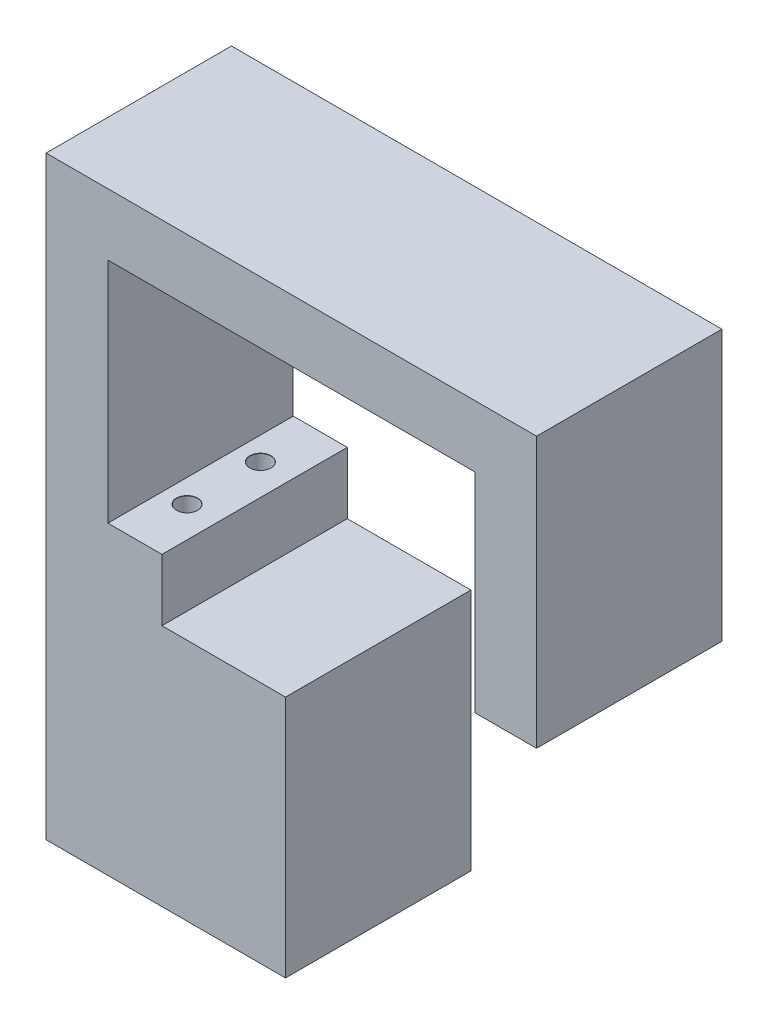
ISO-10303-21;
HEADER;
FILE_DESCRIPTION(('STEP AP214'),'2;1');
FILE_NAME('part.step','',(''),(''),'','','');
FILE_SCHEMA(('AUTOMOTIVE_DESIGN { 1 0 10303 214 1 1 1 1 }'));
ENDSEC;
DATA;
#1=APPLICATION_CONTEXT('core data for automotive mechanical design processes');
#2=APPLICATION_PROTOCOL_DEFINITION('international standard','automotive_design',2000,#1);
#3=PRODUCT_CONTEXT('',#1,'mechanical');
#4=PRODUCT('Part','Part','',(#3));
#5=PRODUCT_RELATED_PRODUCT_CATEGORY('part','',(#4));
#6=PRODUCT_DEFINITION_FORMATION('','',#4);
#7=PRODUCT_DEFINITION_CONTEXT('part definition',#1,'design');
#8=PRODUCT_DEFINITION('design','',#6,#7);
#9=PRODUCT_DEFINITION_SHAPE('','',#8);
#10=(LENGTH_UNIT() NAMED_UNIT(*) SI_UNIT(.MILLI.,.METRE.));
#11=(NAMED_UNIT(*) PLANE_ANGLE_UNIT() SI_UNIT($,.RADIAN.));
#12=(NAMED_UNIT(*) SI_UNIT($,.STERADIAN.) SOLID_ANGLE_UNIT());
#13=UNCERTAINTY_MEASURE_WITH_UNIT(LENGTH_MEASURE(1.E-05),#10,'distance_accuracy_value','');
#14=(GEOMETRIC_REPRESENTATION_CONTEXT(3) GLOBAL_UNCERTAINTY_ASSIGNED_CONTEXT((#13)) GLOBAL_UNIT_ASSIGNED_CONTEXT((#10,
#11,#12)) REPRESENTATION_CONTEXT('',''));
#15=CARTESIAN_POINT('',(0.,0.,0.));
#16=DIRECTION('',(0.,0.,1.));
#17=DIRECTION('',(1.,0.,0.));
#18=AXIS2_PLACEMENT_3D('',#15,#16,#17);
#19=CARTESIAN_POINT('',(0.,31.5,12.));
#20=DIRECTION('',(-1.,0.,0.));
#21=DIRECTION('',(0.,-1.,0.));
#22=AXIS2_PLACEMENT_3D('',#19,#20,#21);
#23=PLANE('',#22);
#24=DIRECTION('',(0.,1.,0.));
#25=VECTOR('',#24,1.);
#26=CARTESIAN_POINT('',(0.,31.5,-12.));
#27=LINE('',#26,#25);
#28=CARTESIAN_POINT('',(0.,0.,-12.));
#29=VERTEX_POINT('',#28);
#30=CARTESIAN_POINT('',(0.,31.5,-12.));
#31=VERTEX_POINT('',#30);
#32=EDGE_CURVE('E170',#29,#31,#27,.T.);
#33=ORIENTED_EDGE('',*,*,#32,.T.);
#34=DIRECTION('',(0.,0.,-1.));
#35=VECTOR('',#34,1.);
#36=CARTESIAN_POINT('',(0.,31.5,12.));
#37=LINE('',#36,#35);
#38=CARTESIAN_POINT('',(0.,31.5,12.));
#39=VERTEX_POINT('',#38);
#40=EDGE_CURVE('E11',#39,#31,#37,.T.);
#41=ORIENTED_EDGE('',*,*,#40,.F.);
#42=DIRECTION('',(0.,1.,0.));
#43=VECTOR('',#42,1.);
#44=CARTESIAN_POINT('',(0.,31.5,12.));
#45=LINE('',#44,#43);
#46=CARTESIAN_POINT('',(0.,0.,12.));
#47=VERTEX_POINT('',#46);
#48=EDGE_CURVE('E195',#47,#39,#45,.T.);
#49=ORIENTED_EDGE('',*,*,#48,.F.);
#50=DIRECTION('',(0.,0.,-1.));
#51=VECTOR('',#50,1.);
#52=CARTESIAN_POINT('',(0.,0.,12.));
#53=LINE('',#52,#51);
#54=EDGE_CURVE('E166',#47,#29,#53,.T.);
#55=ORIENTED_EDGE('',*,*,#54,.T.);
#56=EDGE_LOOP('',(#33,#41,#49,#55));
#57=FACE_BOUND('',#56,.T.);
#58=ADVANCED_FACE('F47',(#57),#23,.F.);
#59=CARTESIAN_POINT('',(-16.,31.5,12.));
#60=DIRECTION('',(0.,-1.,0.));
#61=DIRECTION('',(0.,0.,-1.));
#62=AXIS2_PLACEMENT_3D('',#59,#60,#61);
#63=PLANE('',#62);
#64=DIRECTION('',(-1.,0.,0.));
#65=VECTOR('',#64,1.);
#66=CARTESIAN_POINT('',(-16.,31.5,-12.));
#67=LINE('',#66,#65);
#68=CARTESIAN_POINT('',(-16.,31.5,-12.));
#69=VERTEX_POINT('',#68);
#70=EDGE_CURVE('E173',#31,#69,#67,.T.);
#71=ORIENTED_EDGE('',*,*,#70,.T.);
#72=DIRECTION('',(0.,0.,-1.));
#73=VECTOR('',#72,1.);
#74=CARTESIAN_POINT('',(-16.,31.5,12.));
#75=LINE('',#74,#73);
#76=CARTESIAN_POINT('',(-16.,31.5,12.));
#77=VERTEX_POINT('',#76);
#78=EDGE_CURVE('E55',#77,#69,#75,.T.);
#79=ORIENTED_EDGE('',*,*,#78,.F.);
#80=DIRECTION('',(-1.,0.,0.));
#81=VECTOR('',#80,1.);
#82=CARTESIAN_POINT('',(-16.,31.5,12.));
#83=LINE('',#82,#81);
#84=EDGE_CURVE('E117',#39,#77,#83,.T.);
#85=ORIENTED_EDGE('',*,*,#84,.F.);
#86=ORIENTED_EDGE('',*,*,#40,.T.);
#87=EDGE_LOOP('',(#71,#79,#85,#86));
#88=FACE_BOUND('',#87,.T.);
#89=ADVANCED_FACE('F327',(#88),#63,.F.);
#90=CARTESIAN_POINT('',(-16.,39.5,12.));
#91=DIRECTION('',(-1.,0.,0.));
#92=DIRECTION('',(0.,0.,1.));
#93=AXIS2_PLACEMENT_3D('',#90,#91,#92);
#94=PLANE('',#93);
#95=DIRECTION('',(0.,1.,0.));
#96=VECTOR('',#95,1.);
#97=CARTESIAN_POINT('',(-16.,39.5,-12.));
#98=LINE('',#97,#96);
#99=CARTESIAN_POINT('',(-16.,39.5,-12.));
#100=VERTEX_POINT('',#99);
#101=EDGE_CURVE('E176',#69,#100,#98,.T.);
#102=ORIENTED_EDGE('',*,*,#101,.T.);
#103=DIRECTION('',(0.,0.,-1.));
#104=VECTOR('',#103,1.);
#105=CARTESIAN_POINT('',(-16.,39.5,12.));
#106=LINE('',#105,#104);
#107=CARTESIAN_POINT('',(-16.,39.5,12.));
#108=VERTEX_POINT('',#107);
#109=EDGE_CURVE('E214',#108,#100,#106,.T.);
#110=ORIENTED_EDGE('',*,*,#109,.F.);
#111=DIRECTION('',(0.,1.,0.));
#112=VECTOR('',#111,1.);
#113=CARTESIAN_POINT('',(-16.,39.5,12.));
#114=LINE('',#113,#112);
#115=EDGE_CURVE('E222',#77,#108,#114,.T.);
#116=ORIENTED_EDGE('',*,*,#115,.F.);
#117=ORIENTED_EDGE('',*,*,#78,.T.);
#118=EDGE_LOOP('',(#102,#110,#116,#117));
#119=FACE_BOUND('',#118,.T.);
#120=ADVANCED_FACE('F220',(#119),#94,.F.);
#121=CARTESIAN_POINT('',(-23.,39.5,12.));
#122=DIRECTION('',(0.,-1.,0.));
#123=DIRECTION('',(0.,0.,-1.));
#124=AXIS2_PLACEMENT_3D('',#121,#122,#123);
#125=PLANE('',#124);
#126=CARTESIAN_POINT('',(-20.,39.5,-4.75));
#127=DIRECTION('',(0.,1.,0.));
#128=DIRECTION('',(0.,0.,1.));
#129=AXIS2_PLACEMENT_3D('',#126,#127,#128);
#130=CIRCLE('',#129,1.375);
#131=CARTESIAN_POINT('',(-20.,39.5,-3.375));
#132=VERTEX_POINT('',#131);
#133=EDGE_CURVE('E279',#132,#132,#130,.T.);
#134=ORIENTED_EDGE('',*,*,#133,.F.);
#135=EDGE_LOOP('',(#134));
#136=FACE_BOUND('',#135,.T.);
#137=CARTESIAN_POINT('',(-20.,39.5,4.75));
#138=DIRECTION('',(0.,1.,0.));
#139=DIRECTION('',(0.,0.,1.));
#140=AXIS2_PLACEMENT_3D('',#137,#138,#139);
#141=CIRCLE('',#140,1.375);
#142=CARTESIAN_POINT('',(-20.,39.5,6.125));
#143=VERTEX_POINT('',#142);
#144=EDGE_CURVE('E270',#143,#143,#141,.T.);
#145=ORIENTED_EDGE('',*,*,#144,.F.);
#146=EDGE_LOOP('',(#145));
#147=FACE_BOUND('',#146,.T.);
#148=DIRECTION('',(-1.,0.,0.));
#149=VECTOR('',#148,1.);
#150=CARTESIAN_POINT('',(-23.,39.5,-12.));
#151=LINE('',#150,#149);
#152=CARTESIAN_POINT('',(-23.,39.5,-12.));
#153=VERTEX_POINT('',#152);
#154=EDGE_CURVE('E178',#100,#153,#151,.T.);
#155=ORIENTED_EDGE('',*,*,#154,.T.);
#156=DIRECTION('',(0.,0.,-1.));
#157=VECTOR('',#156,1.);
#158=CARTESIAN_POINT('',(-23.,39.5,12.));
#159=LINE('',#158,#157);
#160=CARTESIAN_POINT('',(-23.,39.5,12.));
#161=VERTEX_POINT('',#160);
#162=EDGE_CURVE('E211',#161,#153,#159,.T.);
#163=ORIENTED_EDGE('',*,*,#162,.F.);
#164=DIRECTION('',(-1.,0.,0.));
#165=VECTOR('',#164,1.);
#166=CARTESIAN_POINT('',(-23.,39.5,12.));
#167=LINE('',#166,#165);
#168=EDGE_CURVE('E238',#108,#161,#167,.T.);
#169=ORIENTED_EDGE('',*,*,#168,.F.);
#170=ORIENTED_EDGE('',*,*,#109,.T.);
#171=EDGE_LOOP('',(#155,#163,#169,#170));
#172=FACE_BOUND('',#171,.T.);
#173=ADVANCED_FACE('F229',(#136,#147,#172),#125,.F.);
#174=CARTESIAN_POINT('',(-23.,39.5,12.));
#175=DIRECTION('',(-1.,0.,0.));
#176=DIRECTION('',(0.,0.,1.));
#177=AXIS2_PLACEMENT_3D('',#174,#175,#176);
#178=PLANE('',#177);
#179=DIRECTION('',(0.,1.,0.));
#180=VECTOR('',#179,1.);
#181=CARTESIAN_POINT('',(-23.,39.5,-12.));
#182=LINE('',#181,#180);
#183=CARTESIAN_POINT('',(-23.,69.,-12.));
#184=VERTEX_POINT('',#183);
#185=EDGE_CURVE('E180',#153,#184,#182,.T.);
#186=ORIENTED_EDGE('',*,*,#185,.T.);
#187=DIRECTION('',(0.,0.,-1.));
#188=VECTOR('',#187,1.);
#189=CARTESIAN_POINT('',(-23.,69.,12.));
#190=LINE('',#189,#188);
#191=CARTESIAN_POINT('',(-23.,69.,12.));
#192=VERTEX_POINT('',#191);
#193=EDGE_CURVE('E208',#192,#184,#190,.T.);
#194=ORIENTED_EDGE('',*,*,#193,.F.);
#195=DIRECTION('',(0.,1.,0.));
#196=VECTOR('',#195,1.);
#197=CARTESIAN_POINT('',(-23.,39.5,12.));
#198=LINE('',#197,#196);
#199=EDGE_CURVE('E235',#161,#192,#198,.T.);
#200=ORIENTED_EDGE('',*,*,#199,.F.);
#201=ORIENTED_EDGE('',*,*,#162,.T.);
#202=EDGE_LOOP('',(#186,#194,#200,#201));
#203=FACE_BOUND('',#202,.T.);
#204=ADVANCED_FACE('F233',(#203),#178,.F.);
#205=CARTESIAN_POINT('',(-23.,69.,12.));
#206=DIRECTION('',(0.,1.,0.));
#207=DIRECTION('',(0.,0.,1.));
#208=AXIS2_PLACEMENT_3D('',#205,#206,#207);
#209=PLANE('',#208);
#210=DIRECTION('',(1.,0.,0.));
#211=VECTOR('',#210,1.);
#212=CARTESIAN_POINT('',(-23.,69.,-12.));
#213=LINE('',#212,#211);
#214=CARTESIAN_POINT('',(24.5,69.,-12.));
#215=VERTEX_POINT('',#214);
#216=EDGE_CURVE('E182',#184,#215,#213,.T.);
#217=ORIENTED_EDGE('',*,*,#216,.T.);
#218=DIRECTION('',(0.,0.,-1.));
#219=VECTOR('',#218,1.);
#220=CARTESIAN_POINT('',(24.5,69.,12.));
#221=LINE('',#220,#219);
#222=CARTESIAN_POINT('',(24.5,69.,12.));
#223=VERTEX_POINT('',#222);
#224=EDGE_CURVE('E205',#223,#215,#221,.T.);
#225=ORIENTED_EDGE('',*,*,#224,.F.);
#226=DIRECTION('',(1.,0.,0.));
#227=VECTOR('',#226,1.);
#228=CARTESIAN_POINT('',(-23.,69.,12.));
#229=LINE('',#228,#227);
#230=EDGE_CURVE('E237',#192,#223,#229,.T.);
#231=ORIENTED_EDGE('',*,*,#230,.F.);
#232=ORIENTED_EDGE('',*,*,#193,.T.);
#233=EDGE_LOOP('',(#217,#225,#231,#232));
#234=FACE_BOUND('',#233,.T.);
#235=ADVANCED_FACE('F341',(#234),#209,.F.);
#236=CARTESIAN_POINT('',(24.5,69.,12.));
#237=DIRECTION('',(1.,0.,0.));
#238=DIRECTION('',(0.,1.,0.));
#239=AXIS2_PLACEMENT_3D('',#236,#237,#238);
#240=PLANE('',#239);
#241=DIRECTION('',(0.,-1.,0.));
#242=VECTOR('',#241,1.);
#243=CARTESIAN_POINT('',(24.5,69.,-12.));
#244=LINE('',#243,#242);
#245=CARTESIAN_POINT('',(24.5,42.,-12.));
#246=VERTEX_POINT('',#245);
#247=EDGE_CURVE('E184',#215,#246,#244,.T.);
#248=ORIENTED_EDGE('',*,*,#247,.T.);
#249=DIRECTION('',(0.,0.,-1.));
#250=VECTOR('',#249,1.);
#251=CARTESIAN_POINT('',(24.5,42.,12.));
#252=LINE('',#251,#250);
#253=CARTESIAN_POINT('',(24.5,42.,12.));
#254=VERTEX_POINT('',#253);
#255=EDGE_CURVE('E202',#254,#246,#252,.T.);
#256=ORIENTED_EDGE('',*,*,#255,.F.);
#257=DIRECTION('',(0.,-1.,0.));
#258=VECTOR('',#257,1.);
#259=CARTESIAN_POINT('',(24.5,69.,12.));
#260=LINE('',#259,#258);
#261=EDGE_CURVE('E240',#223,#254,#260,.T.);
#262=ORIENTED_EDGE('',*,*,#261,.F.);
#263=ORIENTED_EDGE('',*,*,#224,.T.);
#264=EDGE_LOOP('',(#248,#256,#262,#263));
#265=FACE_BOUND('',#264,.T.);
#266=ADVANCED_FACE('F305',(#265),#240,.F.);
#267=CARTESIAN_POINT('',(24.5,42.,12.));
#268=DIRECTION('',(0.,1.,0.));
#269=DIRECTION('',(0.,0.,1.));
#270=AXIS2_PLACEMENT_3D('',#267,#268,#269);
#271=PLANE('',#270);
#272=CARTESIAN_POINT('',(28.5,42.,-4.75));
#273=DIRECTION('',(0.,-1.,0.));
#274=DIRECTION('',(0.,0.,-1.));
#275=AXIS2_PLACEMENT_3D('',#272,#273,#274);
#276=CIRCLE('',#275,1.375);
#277=CARTESIAN_POINT('',(28.5,42.,-6.125));
#278=VERTEX_POINT('',#277);
#279=EDGE_CURVE('E297',#278,#278,#276,.T.);
#280=ORIENTED_EDGE('',*,*,#279,.F.);
#281=EDGE_LOOP('',(#280));
#282=FACE_BOUND('',#281,.T.);
#283=CARTESIAN_POINT('',(28.5,42.,4.75));
#284=DIRECTION('',(0.,-1.,0.));
#285=DIRECTION('',(0.,0.,-1.));
#286=AXIS2_PLACEMENT_3D('',#283,#284,#285);
#287=CIRCLE('',#286,1.375);
#288=CARTESIAN_POINT('',(28.5,42.,3.375));
#289=VERTEX_POINT('',#288);
#290=EDGE_CURVE('E288',#289,#289,#287,.T.);
#291=ORIENTED_EDGE('',*,*,#290,.F.);
#292=EDGE_LOOP('',(#291));
#293=FACE_BOUND('',#292,.T.);
#294=DIRECTION('',(1.,0.,0.));
#295=VECTOR('',#294,1.);
#296=CARTESIAN_POINT('',(24.5,42.,-12.));
#297=LINE('',#296,#295);
#298=CARTESIAN_POINT('',(32.5,42.,-12.));
#299=VERTEX_POINT('',#298);
#300=EDGE_CURVE('E186',#246,#299,#297,.T.);
#301=ORIENTED_EDGE('',*,*,#300,.T.);
#302=DIRECTION('',(0.,0.,-1.));
#303=VECTOR('',#302,1.);
#304=CARTESIAN_POINT('',(32.5,42.,12.));
#305=LINE('',#304,#303);
#306=CARTESIAN_POINT('',(32.5,42.,12.));
#307=VERTEX_POINT('',#306);
#308=EDGE_CURVE('E199',#307,#299,#305,.T.);
#309=ORIENTED_EDGE('',*,*,#308,.F.);
#310=DIRECTION('',(1.,0.,0.));
#311=VECTOR('',#310,1.);
#312=CARTESIAN_POINT('',(24.5,42.,12.));
#313=LINE('',#312,#311);
#314=EDGE_CURVE('E246',#254,#307,#313,.T.);
#315=ORIENTED_EDGE('',*,*,#314,.F.);
#316=ORIENTED_EDGE('',*,*,#255,.T.);
#317=EDGE_LOOP('',(#301,#309,#315,#316));
#318=FACE_BOUND('',#317,.T.);
#319=ADVANCED_FACE('F252',(#282,#293,#318),#271,.F.);
#320=CARTESIAN_POINT('',(32.5,42.,12.));
#321=DIRECTION('',(-1.,0.,0.));
#322=DIRECTION('',(0.,0.,1.));
#323=AXIS2_PLACEMENT_3D('',#320,#321,#322);
#324=PLANE('',#323);
#325=DIRECTION('',(0.,1.,0.));
#326=VECTOR('',#325,1.);
#327=CARTESIAN_POINT('',(32.5,42.,-12.));
#328=LINE('',#327,#326);
#329=CARTESIAN_POINT('',(32.5,77.,-12.));
#330=VERTEX_POINT('',#329);
#331=EDGE_CURVE('E188',#299,#330,#328,.T.);
#332=ORIENTED_EDGE('',*,*,#331,.T.);
#333=DIRECTION('',(0.,0.,-1.));
#334=VECTOR('',#333,1.);
#335=CARTESIAN_POINT('',(32.5,77.,12.));
#336=LINE('',#335,#334);
#337=CARTESIAN_POINT('',(32.5,77.,12.));
#338=VERTEX_POINT('',#337);
#339=EDGE_CURVE('E161',#338,#330,#336,.T.);
#340=ORIENTED_EDGE('',*,*,#339,.F.);
#341=DIRECTION('',(0.,1.,0.));
#342=VECTOR('',#341,1.);
#343=CARTESIAN_POINT('',(32.5,42.,12.));
#344=LINE('',#343,#342);
#345=EDGE_CURVE('E151',#307,#338,#344,.T.);
#346=ORIENTED_EDGE('',*,*,#345,.F.);
#347=ORIENTED_EDGE('',*,*,#308,.T.);
#348=EDGE_LOOP('',(#332,#340,#346,#347));
#349=FACE_BOUND('',#348,.T.);
#350=ADVANCED_FACE('F256',(#349),#324,.F.);
#351=CARTESIAN_POINT('',(-31.,77.,12.));
#352=DIRECTION('',(0.,-1.,0.));
#353=DIRECTION('',(0.,0.,-1.));
#354=AXIS2_PLACEMENT_3D('',#351,#352,#353);
#355=PLANE('',#354);
#356=DIRECTION('',(-1.,0.,0.));
#357=VECTOR('',#356,1.);
#358=CARTESIAN_POINT('',(-31.,77.,-12.));
#359=LINE('',#358,#357);
#360=CARTESIAN_POINT('',(-31.,77.,-12.));
#361=VERTEX_POINT('',#360);
#362=EDGE_CURVE('E159',#330,#361,#359,.T.);
#363=ORIENTED_EDGE('',*,*,#362,.T.);
#364=DIRECTION('',(0.,0.,-1.));
#365=VECTOR('',#364,1.);
#366=CARTESIAN_POINT('',(-31.,77.,12.));
#367=LINE('',#366,#365);
#368=CARTESIAN_POINT('',(-31.,77.,12.));
#369=VERTEX_POINT('',#368);
#370=EDGE_CURVE('E157',#369,#361,#367,.T.);
#371=ORIENTED_EDGE('',*,*,#370,.F.);
#372=DIRECTION('',(-1.,0.,0.));
#373=VECTOR('',#372,1.);
#374=CARTESIAN_POINT('',(32.5,77.,12.));
#375=LINE('',#374,#373);
#376=EDGE_CURVE('E144',#338,#369,#375,.T.);
#377=ORIENTED_EDGE('',*,*,#376,.F.);
#378=ORIENTED_EDGE('',*,*,#339,.T.);
#379=EDGE_LOOP('',(#363,#371,#377,#378));
#380=FACE_BOUND('',#379,.T.);
#381=ADVANCED_FACE('F158',(#380),#355,.F.);
#382=CARTESIAN_POINT('',(-31.,0.,12.));
#383=DIRECTION('',(1.,0.,0.));
#384=DIRECTION('',(0.,0.,-1.));
#385=AXIS2_PLACEMENT_3D('',#382,#383,#384);
#386=PLANE('',#385);
#387=DIRECTION('',(0.,-1.,0.));
#388=VECTOR('',#387,1.);
#389=CARTESIAN_POINT('',(-31.,0.,-12.));
#390=LINE('',#389,#388);
#391=CARTESIAN_POINT('',(-31.,0.,-12.));
#392=VERTEX_POINT('',#391);
#393=EDGE_CURVE('E192',#361,#392,#390,.T.);
#394=ORIENTED_EDGE('',*,*,#393,.T.);
#395=DIRECTION('',(0.,0.,-1.));
#396=VECTOR('',#395,1.);
#397=CARTESIAN_POINT('',(-31.,0.,12.));
#398=LINE('',#397,#396);
#399=CARTESIAN_POINT('',(-31.,0.,12.));
#400=VERTEX_POINT('',#399);
#401=EDGE_CURVE('E162',#400,#392,#398,.T.);
#402=ORIENTED_EDGE('',*,*,#401,.F.);
#403=DIRECTION('',(0.,-1.,0.));
#404=VECTOR('',#403,1.);
#405=CARTESIAN_POINT('',(-31.,0.,12.));
#406=LINE('',#405,#404);
#407=EDGE_CURVE('E148',#369,#400,#406,.T.);
#408=ORIENTED_EDGE('',*,*,#407,.F.);
#409=ORIENTED_EDGE('',*,*,#370,.T.);
#410=EDGE_LOOP('',(#394,#402,#408,#409));
#411=FACE_BOUND('',#410,.T.);
#412=ADVANCED_FACE('F164',(#411),#386,.F.);
#413=CARTESIAN_POINT('',(0.,0.,12.));
#414=DIRECTION('',(0.,1.,0.));
#415=DIRECTION('',(-1.,0.,0.));
#416=AXIS2_PLACEMENT_3D('',#413,#414,#415);
#417=PLANE('',#416);
#418=DIRECTION('',(1.,0.,0.));
#419=VECTOR('',#418,1.);
#420=CARTESIAN_POINT('',(0.,0.,-12.));
#421=LINE('',#420,#419);
#422=EDGE_CURVE('E105',#392,#29,#421,.T.);
#423=ORIENTED_EDGE('',*,*,#422,.T.);
#424=ORIENTED_EDGE('',*,*,#54,.F.);
#425=DIRECTION('',(1.,0.,0.));
#426=VECTOR('',#425,1.);
#427=CARTESIAN_POINT('',(-23.,0.,12.));
#428=LINE('',#427,#426);
#429=EDGE_CURVE('E63',#400,#47,#428,.T.);
#430=ORIENTED_EDGE('',*,*,#429,.F.);
#431=ORIENTED_EDGE('',*,*,#401,.T.);
#432=EDGE_LOOP('',(#423,#424,#430,#431));
#433=FACE_BOUND('',#432,.T.);
#434=ADVANCED_FACE('F258',(#433),#417,.F.);
#435=CARTESIAN_POINT('',(0.,0.,12.));
#436=DIRECTION('',(0.,0.,-1.));
#437=DIRECTION('',(-1.,0.,0.));
#438=AXIS2_PLACEMENT_3D('',#435,#436,#437);
#439=PLANE('',#438);
#440=ORIENTED_EDGE('',*,*,#48,.T.);
#441=ORIENTED_EDGE('',*,*,#84,.T.);
#442=ORIENTED_EDGE('',*,*,#115,.T.);
#443=ORIENTED_EDGE('',*,*,#168,.T.);
#444=ORIENTED_EDGE('',*,*,#199,.T.);
#445=ORIENTED_EDGE('',*,*,#230,.T.);
#446=ORIENTED_EDGE('',*,*,#261,.T.);
#447=ORIENTED_EDGE('',*,*,#314,.T.);
#448=ORIENTED_EDGE('',*,*,#345,.T.);
#449=ORIENTED_EDGE('',*,*,#376,.T.);
#450=ORIENTED_EDGE('',*,*,#407,.T.);
#451=ORIENTED_EDGE('',*,*,#429,.T.);
#452=EDGE_LOOP('',(#440,#441,#442,#443,#444,#445,#446,#447,#448,#449,#450,#451));
#453=FACE_BOUND('',#452,.T.);
#454=ADVANCED_FACE('F146',(#453),#439,.F.);
#455=CARTESIAN_POINT('',(0.,0.,-12.));
#456=DIRECTION('',(0.,0.,-1.));
#457=DIRECTION('',(-1.,0.,0.));
#458=AXIS2_PLACEMENT_3D('',#455,#456,#457);
#459=PLANE('',#458);
#460=ORIENTED_EDGE('',*,*,#32,.F.);
#461=ORIENTED_EDGE('',*,*,#422,.F.);
#462=ORIENTED_EDGE('',*,*,#393,.F.);
#463=ORIENTED_EDGE('',*,*,#362,.F.);
#464=ORIENTED_EDGE('',*,*,#331,.F.);
#465=ORIENTED_EDGE('',*,*,#300,.F.);
#466=ORIENTED_EDGE('',*,*,#247,.F.);
#467=ORIENTED_EDGE('',*,*,#216,.F.);
#468=ORIENTED_EDGE('',*,*,#185,.F.);
#469=ORIENTED_EDGE('',*,*,#154,.F.);
#470=ORIENTED_EDGE('',*,*,#101,.F.);
#471=ORIENTED_EDGE('',*,*,#70,.F.);
#472=EDGE_LOOP('',(#460,#461,#462,#463,#464,#465,#466,#467,#468,#469,#470,#471));
#473=FACE_BOUND('',#472,.T.);
#474=ADVANCED_FACE('F224',(#473),#459,.T.);
#475=CARTESIAN_POINT('',(-20.,31.5,4.75));
#476=DIRECTION('',(0.,1.,0.));
#477=DIRECTION('',(0.,0.,1.));
#478=AXIS2_PLACEMENT_3D('',#475,#476,#477);
#479=CONICAL_SURFACE('',#478,1.35,1.02974425867665);
#480=CARTESIAN_POINT('',(-20.,30.6888381643128,4.75));
#481=VERTEX_POINT('',#480);
#482=VERTEX_LOOP('',#481);
#483=FACE_BOUND('',#482,.T.);
#484=CARTESIAN_POINT('',(-20.,31.5,4.75));
#485=DIRECTION('',(0.,1.,0.));
#486=DIRECTION('',(0.,0.,1.));
#487=AXIS2_PLACEMENT_3D('',#484,#485,#486);
#488=CIRCLE('',#487,1.35);
#489=CARTESIAN_POINT('',(-20.,31.5,6.1));
#490=VERTEX_POINT('',#489);
#491=EDGE_CURVE('E174',#490,#490,#488,.T.);
#492=ORIENTED_EDGE('',*,*,#491,.T.);
#493=EDGE_LOOP('',(#492));
#494=FACE_BOUND('',#493,.T.);
#495=ADVANCED_FACE('F358',(#483,#494),#479,.F.);
#496=CARTESIAN_POINT('',(-20.,39.5,4.75));
#497=DIRECTION('',(0.,1.,0.));
#498=DIRECTION('',(0.,0.,1.));
#499=AXIS2_PLACEMENT_3D('',#496,#497,#498);
#500=CYLINDRICAL_SURFACE('',#499,1.35);
#501=ORIENTED_EDGE('',*,*,#491,.F.);
#502=EDGE_LOOP('',(#501));
#503=FACE_BOUND('',#502,.T.);
#504=CARTESIAN_POINT('',(-20.,39.475,4.75));
#505=DIRECTION('',(0.,1.,0.));
#506=DIRECTION('',(0.,0.,1.));
#507=AXIS2_PLACEMENT_3D('',#504,#505,#506);
#508=CIRCLE('',#507,1.35);
#509=CARTESIAN_POINT('',(-20.,39.475,6.1));
#510=VERTEX_POINT('',#509);
#511=EDGE_CURVE('E267',#510,#510,#508,.T.);
#512=ORIENTED_EDGE('',*,*,#511,.T.);
#513=EDGE_LOOP('',(#512));
#514=FACE_BOUND('',#513,.T.);
#515=ADVANCED_FACE('F363',(#503,#514),#500,.F.);
#516=CARTESIAN_POINT('',(-20.,39.5,4.75));
#517=DIRECTION('',(0.,1.,0.));
#518=DIRECTION('',(0.,0.,1.));
#519=AXIS2_PLACEMENT_3D('',#516,#517,#518);
#520=CONICAL_SURFACE('',#519,1.375,0.785398163397518);
#521=ORIENTED_EDGE('',*,*,#511,.F.);
#522=EDGE_LOOP('',(#521));
#523=FACE_BOUND('',#522,.T.);
#524=ORIENTED_EDGE('',*,*,#144,.T.);
#525=EDGE_LOOP('',(#524));
#526=FACE_BOUND('',#525,.T.);
#527=ADVANCED_FACE('F367',(#523,#526),#520,.F.);
#528=CARTESIAN_POINT('',(-20.,31.5,-4.75));
#529=DIRECTION('',(0.,1.,0.));
#530=DIRECTION('',(0.,0.,1.));
#531=AXIS2_PLACEMENT_3D('',#528,#529,#530);
#532=CONICAL_SURFACE('',#531,1.35,1.02974425867665);
#533=CARTESIAN_POINT('',(-20.,30.6888381643128,-4.75));
#534=VERTEX_POINT('',#533);
#535=VERTEX_LOOP('',#534);
#536=FACE_BOUND('',#535,.T.);
#537=CARTESIAN_POINT('',(-20.,31.5,-4.75));
#538=DIRECTION('',(0.,1.,0.));
#539=DIRECTION('',(0.,0.,1.));
#540=AXIS2_PLACEMENT_3D('',#537,#538,#539);
#541=CIRCLE('',#540,1.35);
#542=CARTESIAN_POINT('',(-20.,31.5,-3.4));
#543=VERTEX_POINT('',#542);
#544=EDGE_CURVE('E273',#543,#543,#541,.T.);
#545=ORIENTED_EDGE('',*,*,#544,.T.);
#546=EDGE_LOOP('',(#545));
#547=FACE_BOUND('',#546,.T.);
#548=ADVANCED_FACE('F371',(#536,#547),#532,.F.);
#549=CARTESIAN_POINT('',(-20.,39.5,-4.75));
#550=DIRECTION('',(0.,1.,0.));
#551=DIRECTION('',(0.,0.,1.));
#552=AXIS2_PLACEMENT_3D('',#549,#550,#551);
#553=CYLINDRICAL_SURFACE('',#552,1.35);
#554=ORIENTED_EDGE('',*,*,#544,.F.);
#555=EDGE_LOOP('',(#554));
#556=FACE_BOUND('',#555,.T.);
#557=CARTESIAN_POINT('',(-20.,39.475,-4.75));
#558=DIRECTION('',(0.,1.,0.));
#559=DIRECTION('',(0.,0.,1.));
#560=AXIS2_PLACEMENT_3D('',#557,#558,#559);
#561=CIRCLE('',#560,1.35);
#562=CARTESIAN_POINT('',(-20.,39.475,-3.4));
#563=VERTEX_POINT('',#562);
#564=EDGE_CURVE('E276',#563,#563,#561,.T.);
#565=ORIENTED_EDGE('',*,*,#564,.T.);
#566=EDGE_LOOP('',(#565));
#567=FACE_BOUND('',#566,.T.);
#568=ADVANCED_FACE('F375',(#556,#567),#553,.F.);
#569=CARTESIAN_POINT('',(-20.,39.5,-4.75));
#570=DIRECTION('',(0.,1.,0.));
#571=DIRECTION('',(0.,0.,1.));
#572=AXIS2_PLACEMENT_3D('',#569,#570,#571);
#573=CONICAL_SURFACE('',#572,1.375,0.785398163397448);
#574=ORIENTED_EDGE('',*,*,#564,.F.);
#575=EDGE_LOOP('',(#574));
#576=FACE_BOUND('',#575,.T.);
#577=ORIENTED_EDGE('',*,*,#133,.T.);
#578=EDGE_LOOP('',(#577));
#579=FACE_BOUND('',#578,.T.);
#580=ADVANCED_FACE('F379',(#576,#579),#573,.F.);
#581=CARTESIAN_POINT('',(28.5,50.,4.75));
#582=DIRECTION('',(0.,-1.,0.));
#583=DIRECTION('',(0.,0.,-1.));
#584=AXIS2_PLACEMENT_3D('',#581,#582,#583);
#585=CONICAL_SURFACE('',#584,1.34999999999999,1.02974425867665);
#586=CARTESIAN_POINT('',(28.5,50.8111618356872,4.75));
#587=VERTEX_POINT('',#586);
#588=VERTEX_LOOP('',#587);
#589=FACE_BOUND('',#588,.T.);
#590=CARTESIAN_POINT('',(28.5,50.,4.75));
#591=DIRECTION('',(0.,-1.,0.));
#592=DIRECTION('',(0.,0.,-1.));
#593=AXIS2_PLACEMENT_3D('',#590,#591,#592);
#594=CIRCLE('',#593,1.34999999999999);
#595=CARTESIAN_POINT('',(28.5,50.,3.40000000000001));
#596=VERTEX_POINT('',#595);
#597=EDGE_CURVE('E282',#596,#596,#594,.T.);
#598=ORIENTED_EDGE('',*,*,#597,.T.);
#599=EDGE_LOOP('',(#598));
#600=FACE_BOUND('',#599,.T.);
#601=ADVANCED_FACE('F322',(#589,#600),#585,.F.);
#602=CARTESIAN_POINT('',(28.5,42.,4.75));
#603=DIRECTION('',(0.,-1.,0.));
#604=DIRECTION('',(0.,0.,-1.));
#605=AXIS2_PLACEMENT_3D('',#602,#603,#604);
#606=CYLINDRICAL_SURFACE('',#605,1.34999999999999);
#607=ORIENTED_EDGE('',*,*,#597,.F.);
#608=EDGE_LOOP('',(#607));
#609=FACE_BOUND('',#608,.T.);
#610=CARTESIAN_POINT('',(28.5,42.025,4.75));
#611=DIRECTION('',(0.,-1.,0.));
#612=DIRECTION('',(0.,0.,-1.));
#613=AXIS2_PLACEMENT_3D('',#610,#611,#612);
#614=CIRCLE('',#613,1.34999999999999);
#615=CARTESIAN_POINT('',(28.5,42.025,3.40000000000001));
#616=VERTEX_POINT('',#615);
#617=EDGE_CURVE('E285',#616,#616,#614,.T.);
#618=ORIENTED_EDGE('',*,*,#617,.T.);
#619=EDGE_LOOP('',(#618));
#620=FACE_BOUND('',#619,.T.);
#621=ADVANCED_FACE('F312',(#609,#620),#606,.F.);
#622=CARTESIAN_POINT('',(28.5,42.,4.75));
#623=DIRECTION('',(0.,-1.,0.));
#624=DIRECTION('',(0.,0.,-1.));
#625=AXIS2_PLACEMENT_3D('',#622,#623,#624);
#626=CONICAL_SURFACE('',#625,1.375,0.785398163397379);
#627=ORIENTED_EDGE('',*,*,#617,.F.);
#628=EDGE_LOOP('',(#627));
#629=FACE_BOUND('',#628,.T.);
#630=ORIENTED_EDGE('',*,*,#290,.T.);
#631=EDGE_LOOP('',(#630));
#632=FACE_BOUND('',#631,.T.);
#633=ADVANCED_FACE('F309',(#629,#632),#626,.F.);
#634=CARTESIAN_POINT('',(28.5,50.,-4.75));
#635=DIRECTION('',(0.,-1.,0.));
#636=DIRECTION('',(0.,0.,-1.));
#637=AXIS2_PLACEMENT_3D('',#634,#635,#636);
#638=CONICAL_SURFACE('',#637,1.34999999999999,1.02974425867665);
#639=CARTESIAN_POINT('',(28.5,50.8111618356872,-4.75));
#640=VERTEX_POINT('',#639);
#641=VERTEX_LOOP('',#640);
#642=FACE_BOUND('',#641,.T.);
#643=CARTESIAN_POINT('',(28.5,50.,-4.75));
#644=DIRECTION('',(0.,-1.,0.));
#645=DIRECTION('',(0.,0.,-1.));
#646=AXIS2_PLACEMENT_3D('',#643,#644,#645);
#647=CIRCLE('',#646,1.34999999999999);
#648=CARTESIAN_POINT('',(28.5,50.,-6.09999999999999));
#649=VERTEX_POINT('',#648);
#650=EDGE_CURVE('E291',#649,#649,#647,.T.);
#651=ORIENTED_EDGE('',*,*,#650,.T.);
#652=EDGE_LOOP('',(#651));
#653=FACE_BOUND('',#652,.T.);
#654=ADVANCED_FACE('F311',(#642,#653),#638,.F.);
#655=CARTESIAN_POINT('',(28.5,42.,-4.75));
#656=DIRECTION('',(0.,-1.,0.));
#657=DIRECTION('',(0.,0.,-1.));
#658=AXIS2_PLACEMENT_3D('',#655,#656,#657);
#659=CYLINDRICAL_SURFACE('',#658,1.34999999999999);
#660=ORIENTED_EDGE('',*,*,#650,.F.);
#661=EDGE_LOOP('',(#660));
#662=FACE_BOUND('',#661,.T.);
#663=CARTESIAN_POINT('',(28.5,42.025,-4.75));
#664=DIRECTION('',(0.,-1.,0.));
#665=DIRECTION('',(0.,0.,-1.));
#666=AXIS2_PLACEMENT_3D('',#663,#664,#665);
#667=CIRCLE('',#666,1.34999999999999);
#668=CARTESIAN_POINT('',(28.5,42.025,-6.09999999999999));
#669=VERTEX_POINT('',#668);
#670=EDGE_CURVE('E294',#669,#669,#667,.T.);
#671=ORIENTED_EDGE('',*,*,#670,.T.);
#672=EDGE_LOOP('',(#671));
#673=FACE_BOUND('',#672,.T.);
#674=ADVANCED_FACE('F319',(#662,#673),#659,.F.);
#675=CARTESIAN_POINT('',(28.5,42.,-4.75));
#676=DIRECTION('',(0.,-1.,0.));
#677=DIRECTION('',(0.,0.,-1.));
#678=AXIS2_PLACEMENT_3D('',#675,#676,#677);
#679=CONICAL_SURFACE('',#678,1.375,0.785398163397379);
#680=ORIENTED_EDGE('',*,*,#670,.F.);
#681=EDGE_LOOP('',(#680));
#682=FACE_BOUND('',#681,.T.);
#683=ORIENTED_EDGE('',*,*,#279,.T.);
#684=EDGE_LOOP('',(#683));
#685=FACE_BOUND('',#684,.T.);
#686=ADVANCED_FACE('F301',(#682,#685),#679,.F.);
#687=CLOSED_SHELL('',(#58,#89,#120,#173,#204,#235,#266,#319,#350,#381,#412,#434,#454,#474,#495,
#515,#527,#548,#568,#580,#601,#621,#633,#654,#674,#686));
#688=MANIFOLD_SOLID_BREP('B2',#687);
#689=ADVANCED_BREP_SHAPE_REPRESENTATION('',(#18,#688),#14);
#690=SHAPE_DEFINITION_REPRESENTATION(#9,#689);
ENDSEC;
END-ISO-10303-21;
